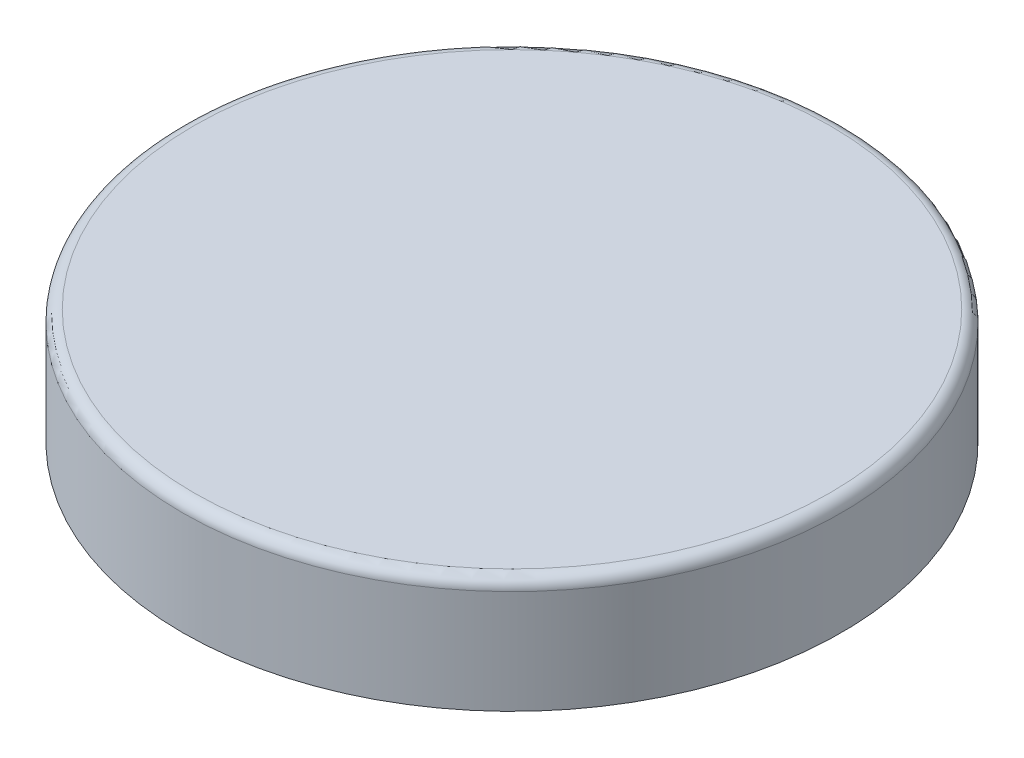
ISO-10303-21;
HEADER;
FILE_DESCRIPTION(('STEP AP214'),'2;1');
FILE_NAME('part.step','',(''),(''),'','','');
FILE_SCHEMA(('AUTOMOTIVE_DESIGN { 1 0 10303 214 1 1 1 1 }'));
ENDSEC;
DATA;
#1=APPLICATION_CONTEXT('core data for automotive mechanical design processes');
#2=APPLICATION_PROTOCOL_DEFINITION('international standard','automotive_design',2000,#1);
#3=PRODUCT_CONTEXT('',#1,'mechanical');
#4=PRODUCT('Part','Part','',(#3));
#5=PRODUCT_RELATED_PRODUCT_CATEGORY('part','',(#4));
#6=PRODUCT_DEFINITION_FORMATION('','',#4);
#7=PRODUCT_DEFINITION_CONTEXT('part definition',#1,'design');
#8=PRODUCT_DEFINITION('design','',#6,#7);
#9=PRODUCT_DEFINITION_SHAPE('','',#8);
#10=(LENGTH_UNIT() NAMED_UNIT(*) SI_UNIT(.MILLI.,.METRE.));
#11=(NAMED_UNIT(*) PLANE_ANGLE_UNIT() SI_UNIT($,.RADIAN.));
#12=(NAMED_UNIT(*) SI_UNIT($,.STERADIAN.) SOLID_ANGLE_UNIT());
#13=UNCERTAINTY_MEASURE_WITH_UNIT(LENGTH_MEASURE(1.E-05),#10,'distance_accuracy_value','');
#14=(GEOMETRIC_REPRESENTATION_CONTEXT(3) GLOBAL_UNCERTAINTY_ASSIGNED_CONTEXT((#13)) GLOBAL_UNIT_ASSIGNED_CONTEXT((#10,
#11,#12)) REPRESENTATION_CONTEXT('',''));
#15=CARTESIAN_POINT('',(0.,0.,0.));
#16=DIRECTION('',(0.,0.,1.));
#17=DIRECTION('',(1.,0.,0.));
#18=AXIS2_PLACEMENT_3D('',#15,#16,#17);
#19=CARTESIAN_POINT('',(0.,5.,0.));
#20=DIRECTION('',(0.,-1.,0.));
#21=DIRECTION('',(0.,0.,-1.));
#22=AXIS2_PLACEMENT_3D('',#19,#20,#21);
#23=CYLINDRICAL_SURFACE('',#22,14.3);
#24=CARTESIAN_POINT('',(0.,4.5,0.));
#25=DIRECTION('',(0.,1.,0.));
#26=DIRECTION('',(0.,0.,1.));
#27=AXIS2_PLACEMENT_3D('',#24,#25,#26);
#28=CIRCLE('',#27,14.3);
#29=CARTESIAN_POINT('',(0.,4.5,14.3));
#30=VERTEX_POINT('',#29);
#31=EDGE_CURVE('E10',#30,#30,#28,.F.);
#32=ORIENTED_EDGE('',*,*,#31,.T.);
#33=EDGE_LOOP('',(#32));
#34=FACE_BOUND('',#33,.T.);
#35=CARTESIAN_POINT('',(0.,0.,0.));
#36=DIRECTION('',(0.,1.,0.));
#37=DIRECTION('',(0.,0.,1.));
#38=AXIS2_PLACEMENT_3D('',#35,#36,#37);
#39=CIRCLE('',#38,14.3);
#40=CARTESIAN_POINT('',(0.,0.,14.3));
#41=VERTEX_POINT('',#40);
#42=EDGE_CURVE('E41',#41,#41,#39,.T.);
#43=ORIENTED_EDGE('',*,*,#42,.T.);
#44=EDGE_LOOP('',(#43));
#45=FACE_BOUND('',#44,.T.);
#46=ADVANCED_FACE('F30',(#34,#45),#23,.T.);
#47=CARTESIAN_POINT('',(0.,5.,0.));
#48=DIRECTION('',(0.,1.,0.));
#49=DIRECTION('',(0.,0.,1.));
#50=AXIS2_PLACEMENT_3D('',#47,#48,#49);
#51=PLANE('',#50);
#52=CARTESIAN_POINT('',(0.,5.,0.));
#53=DIRECTION('',(0.,1.,0.));
#54=DIRECTION('',(0.,0.,1.));
#55=AXIS2_PLACEMENT_3D('',#52,#53,#54);
#56=CIRCLE('',#55,13.8);
#57=CARTESIAN_POINT('',(0.,5.,13.8));
#58=VERTEX_POINT('',#57);
#59=EDGE_CURVE('E37',#58,#58,#56,.T.);
#60=ORIENTED_EDGE('',*,*,#59,.T.);
#61=EDGE_LOOP('',(#60));
#62=FACE_BOUND('',#61,.T.);
#63=ADVANCED_FACE('F69',(#62),#51,.T.);
#64=CARTESIAN_POINT('',(0.,0.,0.));
#65=DIRECTION('',(0.,1.,0.));
#66=DIRECTION('',(0.,0.,1.));
#67=AXIS2_PLACEMENT_3D('',#64,#65,#66);
#68=PLANE('',#67);
#69=CARTESIAN_POINT('',(0.,0.,0.));
#70=DIRECTION('',(0.,1.,0.));
#71=DIRECTION('',(0.,0.,1.));
#72=AXIS2_PLACEMENT_3D('',#69,#70,#71);
#73=CIRCLE('',#72,13.8);
#74=CARTESIAN_POINT('',(0.,0.,13.8));
#75=VERTEX_POINT('',#74);
#76=EDGE_CURVE('E48',#75,#75,#73,.T.);
#77=ORIENTED_EDGE('',*,*,#76,.T.);
#78=EDGE_LOOP('',(#77));
#79=FACE_BOUND('',#78,.T.);
#80=ORIENTED_EDGE('',*,*,#42,.F.);
#81=EDGE_LOOP('',(#80));
#82=FACE_BOUND('',#81,.T.);
#83=ADVANCED_FACE('F65',(#79,#82),#68,.F.);
#84=CARTESIAN_POINT('',(0.,5.,0.));
#85=DIRECTION('',(0.,-1.,0.));
#86=DIRECTION('',(0.,0.,-1.));
#87=AXIS2_PLACEMENT_3D('',#84,#85,#86);
#88=CYLINDRICAL_SURFACE('',#87,13.8);
#89=CARTESIAN_POINT('',(0.,4.5,0.));
#90=DIRECTION('',(0.,1.,0.));
#91=DIRECTION('',(0.,0.,1.));
#92=AXIS2_PLACEMENT_3D('',#89,#90,#91);
#93=CIRCLE('',#92,13.8);
#94=CARTESIAN_POINT('',(0.,4.5,13.8));
#95=VERTEX_POINT('',#94);
#96=EDGE_CURVE('E45',#95,#95,#93,.T.);
#97=ORIENTED_EDGE('',*,*,#96,.T.);
#98=EDGE_LOOP('',(#97));
#99=FACE_BOUND('',#98,.T.);
#100=ORIENTED_EDGE('',*,*,#76,.F.);
#101=EDGE_LOOP('',(#100));
#102=FACE_BOUND('',#101,.T.);
#103=ADVANCED_FACE('F54',(#99,#102),#88,.F.);
#104=CARTESIAN_POINT('',(0.,4.5,0.));
#105=DIRECTION('',(0.,1.,0.));
#106=DIRECTION('',(0.,0.,1.));
#107=AXIS2_PLACEMENT_3D('',#104,#105,#106);
#108=PLANE('',#107);
#109=ORIENTED_EDGE('',*,*,#96,.F.);
#110=EDGE_LOOP('',(#109));
#111=FACE_BOUND('',#110,.T.);
#112=ADVANCED_FACE('F57',(#111),#108,.F.);
#113=CARTESIAN_POINT('',(0.,4.5,0.));
#114=DIRECTION('',(0.,1.,0.));
#115=DIRECTION('',(0.,0.,1.));
#116=AXIS2_PLACEMENT_3D('',#113,#114,#115);
#117=TOROIDAL_SURFACE('',#116,13.8,0.5);
#118=ORIENTED_EDGE('',*,*,#31,.F.);
#119=EDGE_LOOP('',(#118));
#120=FACE_BOUND('',#119,.T.);
#121=ORIENTED_EDGE('',*,*,#59,.F.);
#122=EDGE_LOOP('',(#121));
#123=FACE_BOUND('',#122,.T.);
#124=ADVANCED_FACE('F32',(#120,#123),#117,.T.);
#125=CLOSED_SHELL('',(#46,#63,#83,#103,#112,#124));
#126=MANIFOLD_SOLID_BREP('B2',#125);
#127=ADVANCED_BREP_SHAPE_REPRESENTATION('',(#18,#126),#14);
#128=SHAPE_DEFINITION_REPRESENTATION(#9,#127);
ENDSEC;
END-ISO-10303-21;
